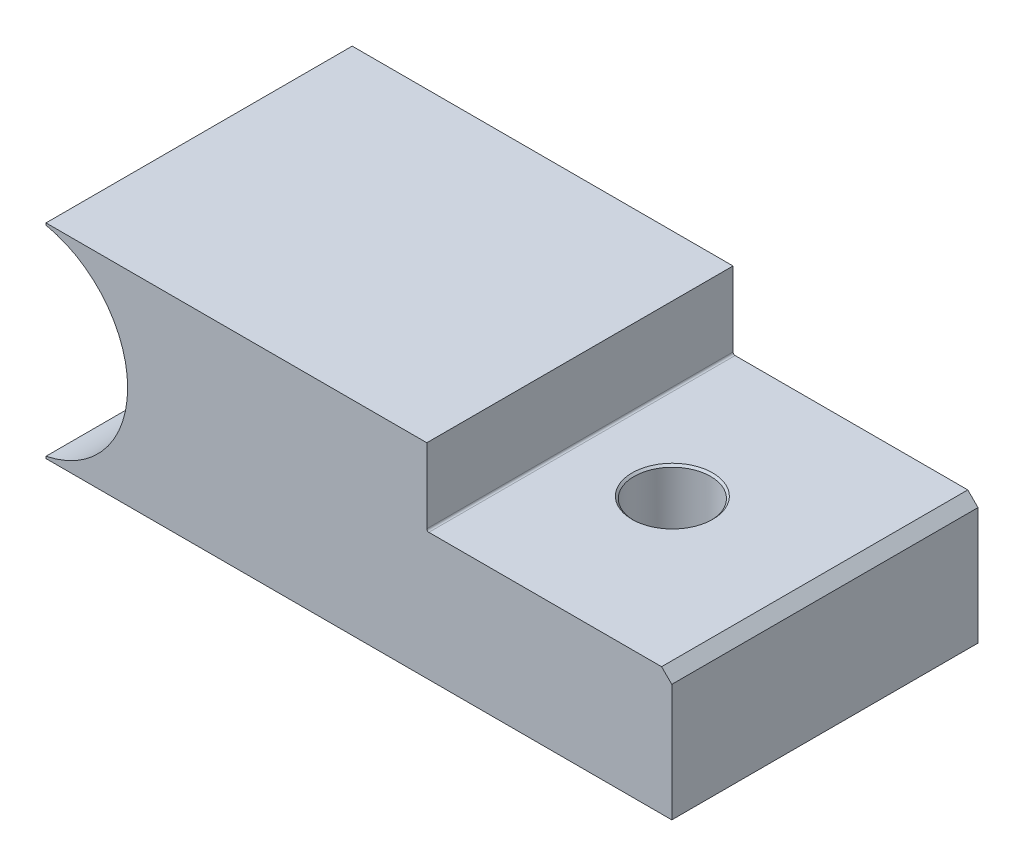
ISO-10303-21;
HEADER;
FILE_DESCRIPTION(('STEP AP214'),'2;1');
FILE_NAME('part.step','',(''),(''),'','','');
FILE_SCHEMA(('AUTOMOTIVE_DESIGN { 1 0 10303 214 1 1 1 1 }'));
ENDSEC;
DATA;
#1=APPLICATION_CONTEXT('core data for automotive mechanical design processes');
#2=APPLICATION_PROTOCOL_DEFINITION('international standard','automotive_design',2000,#1);
#3=PRODUCT_CONTEXT('',#1,'mechanical');
#4=PRODUCT('Part','Part','',(#3));
#5=PRODUCT_RELATED_PRODUCT_CATEGORY('part','',(#4));
#6=PRODUCT_DEFINITION_FORMATION('','',#4);
#7=PRODUCT_DEFINITION_CONTEXT('part definition',#1,'design');
#8=PRODUCT_DEFINITION('design','',#6,#7);
#9=PRODUCT_DEFINITION_SHAPE('','',#8);
#10=(LENGTH_UNIT() NAMED_UNIT(*) SI_UNIT(.MILLI.,.METRE.));
#11=(NAMED_UNIT(*) PLANE_ANGLE_UNIT() SI_UNIT($,.RADIAN.));
#12=(NAMED_UNIT(*) SI_UNIT($,.STERADIAN.) SOLID_ANGLE_UNIT());
#13=UNCERTAINTY_MEASURE_WITH_UNIT(LENGTH_MEASURE(1.E-05),#10,'distance_accuracy_value','');
#14=(GEOMETRIC_REPRESENTATION_CONTEXT(3) GLOBAL_UNCERTAINTY_ASSIGNED_CONTEXT((#13)) GLOBAL_UNIT_ASSIGNED_CONTEXT((#10,
#11,#12)) REPRESENTATION_CONTEXT('',''));
#15=CARTESIAN_POINT('',(0.,0.,0.));
#16=DIRECTION('',(0.,0.,1.));
#17=DIRECTION('',(1.,0.,0.));
#18=AXIS2_PLACEMENT_3D('',#15,#16,#17);
#19=CARTESIAN_POINT('',(2.54,25.4,38.1));
#20=DIRECTION('',(1.,0.,0.));
#21=DIRECTION('',(0.,0.,-1.));
#22=AXIS2_PLACEMENT_3D('',#19,#20,#21);
#23=PLANE('',#22);
#24=DIRECTION('',(0.,-1.,0.));
#25=VECTOR('',#24,1.);
#26=CARTESIAN_POINT('',(2.54,25.4,0.));
#27=LINE('',#26,#25);
#28=CARTESIAN_POINT('',(2.54,25.4,0.));
#29=VERTEX_POINT('',#28);
#30=CARTESIAN_POINT('',(2.54,25.1434078933385,0.));
#31=VERTEX_POINT('',#30);
#32=EDGE_CURVE('E155',#29,#31,#27,.T.);
#33=ORIENTED_EDGE('',*,*,#32,.T.);
#34=DIRECTION('',(0.,0.,-1.));
#35=VECTOR('',#34,1.);
#36=CARTESIAN_POINT('',(2.54,25.1434078933385,38.1));
#37=LINE('',#36,#35);
#38=CARTESIAN_POINT('',(2.54,25.1434078933385,38.1));
#39=VERTEX_POINT('',#38);
#40=EDGE_CURVE('E133',#39,#31,#37,.T.);
#41=ORIENTED_EDGE('',*,*,#40,.F.);
#42=DIRECTION('',(0.,-1.,0.));
#43=VECTOR('',#42,1.);
#44=CARTESIAN_POINT('',(2.54,25.4,38.1));
#45=LINE('',#44,#43);
#46=CARTESIAN_POINT('',(2.54,25.4,38.1));
#47=VERTEX_POINT('',#46);
#48=EDGE_CURVE('E141',#47,#39,#45,.T.);
#49=ORIENTED_EDGE('',*,*,#48,.F.);
#50=DIRECTION('',(0.,0.,-1.));
#51=VECTOR('',#50,1.);
#52=CARTESIAN_POINT('',(2.54,25.4,38.1));
#53=LINE('',#52,#51);
#54=EDGE_CURVE('E212',#47,#29,#53,.T.);
#55=ORIENTED_EDGE('',*,*,#54,.T.);
#56=EDGE_LOOP('',(#33,#41,#49,#55));
#57=FACE_BOUND('',#56,.T.);
#58=ADVANCED_FACE('F51',(#57),#23,.F.);
#59=CARTESIAN_POINT('',(0.,12.7,38.1));
#60=DIRECTION('',(0.,0.,-1.));
#61=DIRECTION('',(-1.,0.,0.));
#62=AXIS2_PLACEMENT_3D('',#59,#60,#61);
#63=CYLINDRICAL_SURFACE('',#62,12.7);
#64=CARTESIAN_POINT('',(0.,12.7,0.));
#65=DIRECTION('',(0.,0.,-1.));
#66=DIRECTION('',(1.,0.,0.));
#67=AXIS2_PLACEMENT_3D('',#64,#65,#66);
#68=CIRCLE('',#67,12.7);
#69=CARTESIAN_POINT('',(2.54,0.256592106661457,0.));
#70=VERTEX_POINT('',#69);
#71=EDGE_CURVE('E240',#31,#70,#68,.T.);
#72=ORIENTED_EDGE('',*,*,#71,.T.);
#73=DIRECTION('',(0.,0.,-1.));
#74=VECTOR('',#73,1.);
#75=CARTESIAN_POINT('',(2.54,0.256592106661457,38.1));
#76=LINE('',#75,#74);
#77=CARTESIAN_POINT('',(2.54,0.256592106661457,38.1));
#78=VERTEX_POINT('',#77);
#79=EDGE_CURVE('E136',#78,#70,#76,.T.);
#80=ORIENTED_EDGE('',*,*,#79,.F.);
#81=CARTESIAN_POINT('',(0.,12.7,38.1));
#82=DIRECTION('',(0.,0.,-1.));
#83=DIRECTION('',(1.,0.,0.));
#84=AXIS2_PLACEMENT_3D('',#81,#82,#83);
#85=CIRCLE('',#84,12.7);
#86=EDGE_CURVE('E129',#39,#78,#85,.T.);
#87=ORIENTED_EDGE('',*,*,#86,.F.);
#88=ORIENTED_EDGE('',*,*,#40,.T.);
#89=EDGE_LOOP('',(#72,#80,#87,#88));
#90=FACE_BOUND('',#89,.T.);
#91=ADVANCED_FACE('F131',(#90),#63,.F.);
#92=CARTESIAN_POINT('',(2.54,0.256592106661457,38.1));
#93=DIRECTION('',(1.,0.,0.));
#94=DIRECTION('',(0.,1.,0.));
#95=AXIS2_PLACEMENT_3D('',#92,#93,#94);
#96=PLANE('',#95);
#97=DIRECTION('',(0.,-1.,0.));
#98=VECTOR('',#97,1.);
#99=CARTESIAN_POINT('',(2.54,0.256592106661457,0.));
#100=LINE('',#99,#98);
#101=CARTESIAN_POINT('',(2.54,0.,0.));
#102=VERTEX_POINT('',#101);
#103=EDGE_CURVE('E234',#70,#102,#100,.T.);
#104=ORIENTED_EDGE('',*,*,#103,.T.);
#105=DIRECTION('',(0.,0.,-1.));
#106=VECTOR('',#105,1.);
#107=CARTESIAN_POINT('',(2.54,0.,38.1));
#108=LINE('',#107,#106);
#109=CARTESIAN_POINT('',(2.54,0.,38.1));
#110=VERTEX_POINT('',#109);
#111=EDGE_CURVE('E164',#110,#102,#108,.T.);
#112=ORIENTED_EDGE('',*,*,#111,.F.);
#113=DIRECTION('',(0.,-1.,0.));
#114=VECTOR('',#113,1.);
#115=CARTESIAN_POINT('',(2.54,0.256592106661457,38.1));
#116=LINE('',#115,#114);
#117=EDGE_CURVE('E140',#78,#110,#116,.T.);
#118=ORIENTED_EDGE('',*,*,#117,.F.);
#119=ORIENTED_EDGE('',*,*,#79,.T.);
#120=EDGE_LOOP('',(#104,#112,#118,#119));
#121=FACE_BOUND('',#120,.T.);
#122=ADVANCED_FACE('F287',(#121),#96,.F.);
#123=CARTESIAN_POINT('',(2.54,0.,38.1));
#124=DIRECTION('',(0.,1.,0.));
#125=DIRECTION('',(-1.,0.,0.));
#126=AXIS2_PLACEMENT_3D('',#123,#124,#125);
#127=PLANE('',#126);
#128=CARTESIAN_POINT('',(61.425582,0.,19.05));
#129=DIRECTION('',(0.,1.,0.));
#130=DIRECTION('',(0.,0.,1.));
#131=AXIS2_PLACEMENT_3D('',#128,#129,#130);
#132=CIRCLE('',#131,4.76249999999999);
#133=CARTESIAN_POINT('',(61.425582,0.,23.8125));
#134=VERTEX_POINT('',#133);
#135=EDGE_CURVE('E247',#134,#134,#132,.T.);
#136=ORIENTED_EDGE('',*,*,#135,.T.);
#137=EDGE_LOOP('',(#136));
#138=FACE_BOUND('',#137,.T.);
#139=DIRECTION('',(1.,0.,0.));
#140=VECTOR('',#139,1.);
#141=CARTESIAN_POINT('',(2.54,0.,0.));
#142=LINE('',#141,#140);
#143=CARTESIAN_POINT('',(80.402581892,0.,0.));
#144=VERTEX_POINT('',#143);
#145=EDGE_CURVE('E229',#102,#144,#142,.T.);
#146=ORIENTED_EDGE('',*,*,#145,.T.);
#147=DIRECTION('',(0.,0.,-1.));
#148=VECTOR('',#147,1.);
#149=CARTESIAN_POINT('',(80.402581892,0.,38.1));
#150=LINE('',#149,#148);
#151=CARTESIAN_POINT('',(80.402581892,0.,38.1));
#152=VERTEX_POINT('',#151);
#153=EDGE_CURVE('E218',#152,#144,#150,.T.);
#154=ORIENTED_EDGE('',*,*,#153,.F.);
#155=DIRECTION('',(1.,0.,0.));
#156=VECTOR('',#155,1.);
#157=CARTESIAN_POINT('',(2.54,0.,38.1));
#158=LINE('',#157,#156);
#159=EDGE_CURVE('E230',#110,#152,#158,.T.);
#160=ORIENTED_EDGE('',*,*,#159,.F.);
#161=ORIENTED_EDGE('',*,*,#111,.T.);
#162=EDGE_LOOP('',(#146,#154,#160,#161));
#163=FACE_BOUND('',#162,.T.);
#164=ADVANCED_FACE('F227',(#138,#163),#127,.F.);
#165=CARTESIAN_POINT('',(80.402581892,0.,38.1));
#166=DIRECTION('',(-1.,0.,0.));
#167=DIRECTION('',(0.,0.,1.));
#168=AXIS2_PLACEMENT_3D('',#165,#166,#167);
#169=PLANE('',#168);
#170=DIRECTION('',(0.,1.,0.));
#171=VECTOR('',#170,1.);
#172=CARTESIAN_POINT('',(80.402581892,0.,0.));
#173=LINE('',#172,#171);
#174=CARTESIAN_POINT('',(80.402581892,14.605,0.));
#175=VERTEX_POINT('',#174);
#176=EDGE_CURVE('E208',#144,#175,#173,.T.);
#177=ORIENTED_EDGE('',*,*,#176,.T.);
#178=DIRECTION('',(0.,0.,1.));
#179=VECTOR('',#178,1.);
#180=CARTESIAN_POINT('',(80.402581892,14.605,38.1));
#181=LINE('',#180,#179);
#182=CARTESIAN_POINT('',(80.402581892,14.605,38.1));
#183=VERTEX_POINT('',#182);
#184=EDGE_CURVE('E170',#175,#183,#181,.T.);
#185=ORIENTED_EDGE('',*,*,#184,.T.);
#186=DIRECTION('',(0.,1.,0.));
#187=VECTOR('',#186,1.);
#188=CARTESIAN_POINT('',(80.402581892,0.,38.1));
#189=LINE('',#188,#187);
#190=EDGE_CURVE('E255',#152,#183,#189,.T.);
#191=ORIENTED_EDGE('',*,*,#190,.F.);
#192=ORIENTED_EDGE('',*,*,#153,.T.);
#193=EDGE_LOOP('',(#177,#185,#191,#192));
#194=FACE_BOUND('',#193,.T.);
#195=ADVANCED_FACE('F306',(#194),#169,.F.);
#196=CARTESIAN_POINT('',(49.922581892,15.875,38.1));
#197=DIRECTION('',(0.,-1.,0.));
#198=DIRECTION('',(1.,0.,0.));
#199=AXIS2_PLACEMENT_3D('',#196,#197,#198);
#200=PLANE('',#199);
#201=CARTESIAN_POINT('',(61.425582,15.875,19.05));
#202=DIRECTION('',(0.,-1.,0.));
#203=DIRECTION('',(1.,0.,0.));
#204=AXIS2_PLACEMENT_3D('',#201,#202,#203);
#205=CIRCLE('',#204,5.01650000000001);
#206=CARTESIAN_POINT('',(66.442082,15.875,19.05));
#207=VERTEX_POINT('',#206);
#208=EDGE_CURVE('E180',#207,#207,#205,.T.);
#209=ORIENTED_EDGE('',*,*,#208,.T.);
#210=EDGE_LOOP('',(#209));
#211=FACE_BOUND('',#210,.T.);
#212=DIRECTION('',(-1.,0.,0.));
#213=VECTOR('',#212,1.);
#214=CARTESIAN_POINT('',(49.922581892,15.875,0.));
#215=LINE('',#214,#213);
#216=CARTESIAN_POINT('',(79.132581892,15.875,0.));
#217=VERTEX_POINT('',#216);
#218=CARTESIAN_POINT('',(50.176581892,15.875,0.));
#219=VERTEX_POINT('',#218);
#220=EDGE_CURVE('E203',#217,#219,#215,.T.);
#221=ORIENTED_EDGE('',*,*,#220,.T.);
#222=DIRECTION('',(0.,0.,-1.));
#223=VECTOR('',#222,1.);
#224=CARTESIAN_POINT('',(50.176581892,15.875,38.1));
#225=LINE('',#224,#223);
#226=CARTESIAN_POINT('',(50.176581892,15.875,38.1));
#227=VERTEX_POINT('',#226);
#228=EDGE_CURVE('E73',#219,#227,#225,.F.);
#229=ORIENTED_EDGE('',*,*,#228,.T.);
#230=DIRECTION('',(-1.,0.,0.));
#231=VECTOR('',#230,1.);
#232=CARTESIAN_POINT('',(49.922581892,15.875,38.1));
#233=LINE('',#232,#231);
#234=CARTESIAN_POINT('',(79.132581892,15.875,38.1));
#235=VERTEX_POINT('',#234);
#236=EDGE_CURVE('E252',#235,#227,#233,.T.);
#237=ORIENTED_EDGE('',*,*,#236,.F.);
#238=DIRECTION('',(0.,0.,-1.));
#239=VECTOR('',#238,1.);
#240=CARTESIAN_POINT('',(79.132581892,15.875,38.1));
#241=LINE('',#240,#239);
#242=EDGE_CURVE('E157',#235,#217,#241,.T.);
#243=ORIENTED_EDGE('',*,*,#242,.T.);
#244=EDGE_LOOP('',(#221,#229,#237,#243));
#245=FACE_BOUND('',#244,.T.);
#246=ADVANCED_FACE('F305',(#211,#245),#200,.F.);
#247=CARTESIAN_POINT('',(49.922581892,25.4,38.1));
#248=DIRECTION('',(-1.,0.,0.));
#249=DIRECTION('',(0.,0.,1.));
#250=AXIS2_PLACEMENT_3D('',#247,#248,#249);
#251=PLANE('',#250);
#252=DIRECTION('',(0.,1.,0.));
#253=VECTOR('',#252,1.);
#254=CARTESIAN_POINT('',(49.922581892,25.4,38.1));
#255=LINE('',#254,#253);
#256=CARTESIAN_POINT('',(49.922581892,16.129,38.1));
#257=VERTEX_POINT('',#256);
#258=CARTESIAN_POINT('',(49.922581892,25.4,38.1));
#259=VERTEX_POINT('',#258);
#260=EDGE_CURVE('E197',#257,#259,#255,.T.);
#261=ORIENTED_EDGE('',*,*,#260,.F.);
#262=DIRECTION('',(0.,0.,-1.));
#263=VECTOR('',#262,1.);
#264=CARTESIAN_POINT('',(49.922581892,16.129,0.));
#265=LINE('',#264,#263);
#266=CARTESIAN_POINT('',(49.922581892,16.129,0.));
#267=VERTEX_POINT('',#266);
#268=EDGE_CURVE('E184',#257,#267,#265,.T.);
#269=ORIENTED_EDGE('',*,*,#268,.T.);
#270=DIRECTION('',(0.,1.,0.));
#271=VECTOR('',#270,1.);
#272=CARTESIAN_POINT('',(49.922581892,25.4,0.));
#273=LINE('',#272,#271);
#274=CARTESIAN_POINT('',(49.922581892,25.4,0.));
#275=VERTEX_POINT('',#274);
#276=EDGE_CURVE('E195',#267,#275,#273,.T.);
#277=ORIENTED_EDGE('',*,*,#276,.T.);
#278=DIRECTION('',(0.,0.,-1.));
#279=VECTOR('',#278,1.);
#280=CARTESIAN_POINT('',(49.922581892,25.4,38.1));
#281=LINE('',#280,#279);
#282=EDGE_CURVE('E215',#259,#275,#281,.T.);
#283=ORIENTED_EDGE('',*,*,#282,.F.);
#284=EDGE_LOOP('',(#261,#269,#277,#283));
#285=FACE_BOUND('',#284,.T.);
#286=ADVANCED_FACE('F193',(#285),#251,.F.);
#287=CARTESIAN_POINT('',(2.54,25.4,38.1));
#288=DIRECTION('',(0.,-1.,0.));
#289=DIRECTION('',(1.,0.,0.));
#290=AXIS2_PLACEMENT_3D('',#287,#288,#289);
#291=PLANE('',#290);
#292=DIRECTION('',(-1.,0.,0.));
#293=VECTOR('',#292,1.);
#294=CARTESIAN_POINT('',(2.54,25.4,0.));
#295=LINE('',#294,#293);
#296=EDGE_CURVE('E152',#275,#29,#295,.T.);
#297=ORIENTED_EDGE('',*,*,#296,.T.);
#298=ORIENTED_EDGE('',*,*,#54,.F.);
#299=DIRECTION('',(-1.,0.,0.));
#300=VECTOR('',#299,1.);
#301=CARTESIAN_POINT('',(2.54,25.4,38.1));
#302=LINE('',#301,#300);
#303=EDGE_CURVE('E147',#259,#47,#302,.T.);
#304=ORIENTED_EDGE('',*,*,#303,.F.);
#305=ORIENTED_EDGE('',*,*,#282,.T.);
#306=EDGE_LOOP('',(#297,#298,#304,#305));
#307=FACE_BOUND('',#306,.T.);
#308=ADVANCED_FACE('F324',(#307),#291,.F.);
#309=CARTESIAN_POINT('',(0.,12.7,38.1));
#310=DIRECTION('',(0.,0.,1.));
#311=DIRECTION('',(1.,0.,0.));
#312=AXIS2_PLACEMENT_3D('',#309,#310,#311);
#313=PLANE('',#312);
#314=ORIENTED_EDGE('',*,*,#190,.T.);
#315=DIRECTION('',(0.707106781186548,-0.707106781186548,0.));
#316=VECTOR('',#315,1.);
#317=CARTESIAN_POINT('',(41.153790946,53.853790946,38.1));
#318=LINE('',#317,#316);
#319=EDGE_CURVE('E173',#183,#235,#318,.F.);
#320=ORIENTED_EDGE('',*,*,#319,.T.);
#321=ORIENTED_EDGE('',*,*,#236,.T.);
#322=CARTESIAN_POINT('',(50.176581892,16.129,38.1));
#323=DIRECTION('',(0.,0.,1.));
#324=DIRECTION('',(1.,0.,0.));
#325=AXIS2_PLACEMENT_3D('',#322,#323,#324);
#326=CIRCLE('',#325,0.254);
#327=EDGE_CURVE('E12',#227,#257,#326,.F.);
#328=ORIENTED_EDGE('',*,*,#327,.T.);
#329=ORIENTED_EDGE('',*,*,#260,.T.);
#330=ORIENTED_EDGE('',*,*,#303,.T.);
#331=ORIENTED_EDGE('',*,*,#48,.T.);
#332=ORIENTED_EDGE('',*,*,#86,.T.);
#333=ORIENTED_EDGE('',*,*,#117,.T.);
#334=ORIENTED_EDGE('',*,*,#159,.T.);
#335=EDGE_LOOP('',(#314,#320,#321,#328,#329,#330,#331,#332,#333,#334));
#336=FACE_BOUND('',#335,.T.);
#337=ADVANCED_FACE('F145',(#336),#313,.T.);
#338=CARTESIAN_POINT('',(0.,12.7,0.));
#339=DIRECTION('',(0.,0.,1.));
#340=DIRECTION('',(1.,0.,0.));
#341=AXIS2_PLACEMENT_3D('',#338,#339,#340);
#342=PLANE('',#341);
#343=ORIENTED_EDGE('',*,*,#220,.F.);
#344=DIRECTION('',(-0.707106781186548,0.707106781186548,0.));
#345=VECTOR('',#344,1.);
#346=CARTESIAN_POINT('',(79.132581892,15.875,0.));
#347=LINE('',#346,#345);
#348=EDGE_CURVE('E162',#217,#175,#347,.F.);
#349=ORIENTED_EDGE('',*,*,#348,.T.);
#350=ORIENTED_EDGE('',*,*,#176,.F.);
#351=ORIENTED_EDGE('',*,*,#145,.F.);
#352=ORIENTED_EDGE('',*,*,#103,.F.);
#353=ORIENTED_EDGE('',*,*,#71,.F.);
#354=ORIENTED_EDGE('',*,*,#32,.F.);
#355=ORIENTED_EDGE('',*,*,#296,.F.);
#356=ORIENTED_EDGE('',*,*,#276,.F.);
#357=CARTESIAN_POINT('',(50.176581892,16.129,0.));
#358=DIRECTION('',(0.,0.,1.));
#359=DIRECTION('',(1.,0.,0.));
#360=AXIS2_PLACEMENT_3D('',#357,#358,#359);
#361=CIRCLE('',#360,0.254);
#362=EDGE_CURVE('E60',#267,#219,#361,.T.);
#363=ORIENTED_EDGE('',*,*,#362,.T.);
#364=EDGE_LOOP('',(#343,#349,#350,#351,#352,#353,#354,#355,#356,#363));
#365=FACE_BOUND('',#364,.T.);
#366=ADVANCED_FACE('F201',(#365),#342,.F.);
#367=CARTESIAN_POINT('',(61.425582,15.875,19.05));
#368=DIRECTION('',(0.,1.,0.));
#369=DIRECTION('',(0.,0.,1.));
#370=AXIS2_PLACEMENT_3D('',#367,#368,#369);
#371=CYLINDRICAL_SURFACE('',#370,4.76249999999999);
#372=CARTESIAN_POINT('',(61.425582,15.621,19.05));
#373=DIRECTION('',(0.,-1.,0.));
#374=DIRECTION('',(0.,0.,-1.));
#375=AXIS2_PLACEMENT_3D('',#372,#373,#374);
#376=CIRCLE('',#375,4.76249999999999);
#377=CARTESIAN_POINT('',(61.425582,15.621,14.2875));
#378=VERTEX_POINT('',#377);
#379=EDGE_CURVE('E176',#378,#378,#376,.F.);
#380=ORIENTED_EDGE('',*,*,#379,.T.);
#381=EDGE_LOOP('',(#380));
#382=FACE_BOUND('',#381,.T.);
#383=ORIENTED_EDGE('',*,*,#135,.F.);
#384=EDGE_LOOP('',(#383));
#385=FACE_BOUND('',#384,.T.);
#386=ADVANCED_FACE('F267',(#382,#385),#371,.F.);
#387=CARTESIAN_POINT('',(79.132581892,15.875,38.1));
#388=DIRECTION('',(-0.707106781186547,-0.707106781186547,0.));
#389=DIRECTION('',(0.,0.,-1.));
#390=AXIS2_PLACEMENT_3D('',#387,#388,#389);
#391=PLANE('',#390);
#392=ORIENTED_EDGE('',*,*,#319,.F.);
#393=ORIENTED_EDGE('',*,*,#184,.F.);
#394=ORIENTED_EDGE('',*,*,#348,.F.);
#395=ORIENTED_EDGE('',*,*,#242,.F.);
#396=EDGE_LOOP('',(#392,#393,#394,#395));
#397=FACE_BOUND('',#396,.T.);
#398=ADVANCED_FACE('F269',(#397),#391,.F.);
#399=CARTESIAN_POINT('',(61.425582,15.621,19.05));
#400=DIRECTION('',(0.,1.,0.));
#401=DIRECTION('',(0.,0.,1.));
#402=AXIS2_PLACEMENT_3D('',#399,#400,#401);
#403=CONICAL_SURFACE('',#402,4.76249999999999,0.785398163397455);
#404=ORIENTED_EDGE('',*,*,#208,.F.);
#405=EDGE_LOOP('',(#404));
#406=FACE_BOUND('',#405,.T.);
#407=ORIENTED_EDGE('',*,*,#379,.F.);
#408=EDGE_LOOP('',(#407));
#409=FACE_BOUND('',#408,.T.);
#410=ADVANCED_FACE('F276',(#406,#409),#403,.F.);
#411=CARTESIAN_POINT('',(50.176581892,16.129,38.1));
#412=DIRECTION('',(0.,0.,1.));
#413=DIRECTION('',(1.,0.,0.));
#414=AXIS2_PLACEMENT_3D('',#411,#412,#413);
#415=CYLINDRICAL_SURFACE('',#414,0.254);
#416=ORIENTED_EDGE('',*,*,#327,.F.);
#417=ORIENTED_EDGE('',*,*,#228,.F.);
#418=ORIENTED_EDGE('',*,*,#362,.F.);
#419=ORIENTED_EDGE('',*,*,#268,.F.);
#420=EDGE_LOOP('',(#416,#417,#418,#419));
#421=FACE_BOUND('',#420,.T.);
#422=ADVANCED_FACE('F53',(#421),#415,.F.);
#423=CLOSED_SHELL('',(#58,#91,#122,#164,#195,#246,#286,#308,#337,#366,#386,#398,#410,#422));
#424=MANIFOLD_SOLID_BREP('B2',#423);
#425=ADVANCED_BREP_SHAPE_REPRESENTATION('',(#18,#424),#14);
#426=SHAPE_DEFINITION_REPRESENTATION(#9,#425);
ENDSEC;
END-ISO-10303-21;
